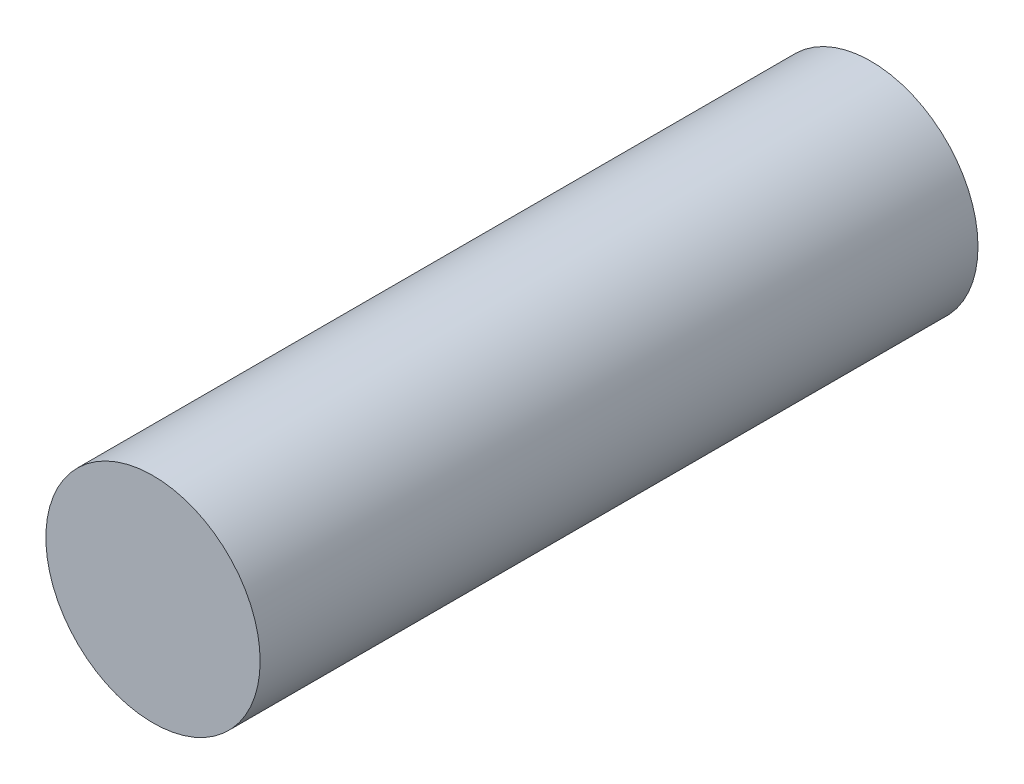
ISO-10303-21;
HEADER;
FILE_DESCRIPTION(('STEP AP214'),'2;1');
FILE_NAME('part.step','',(''),(''),'','','');
FILE_SCHEMA(('AUTOMOTIVE_DESIGN { 1 0 10303 214 1 1 1 1 }'));
ENDSEC;
DATA;
#1=APPLICATION_CONTEXT('core data for automotive mechanical design processes');
#2=APPLICATION_PROTOCOL_DEFINITION('international standard','automotive_design',2000,#1);
#3=PRODUCT_CONTEXT('',#1,'mechanical');
#4=PRODUCT('Part','Part','',(#3));
#5=PRODUCT_RELATED_PRODUCT_CATEGORY('part','',(#4));
#6=PRODUCT_DEFINITION_FORMATION('','',#4);
#7=PRODUCT_DEFINITION_CONTEXT('part definition',#1,'design');
#8=PRODUCT_DEFINITION('design','',#6,#7);
#9=PRODUCT_DEFINITION_SHAPE('','',#8);
#10=(LENGTH_UNIT() NAMED_UNIT(*) SI_UNIT(.MILLI.,.METRE.));
#11=(NAMED_UNIT(*) PLANE_ANGLE_UNIT() SI_UNIT($,.RADIAN.));
#12=(NAMED_UNIT(*) SI_UNIT($,.STERADIAN.) SOLID_ANGLE_UNIT());
#13=UNCERTAINTY_MEASURE_WITH_UNIT(LENGTH_MEASURE(1.E-05),#10,'distance_accuracy_value','');
#14=(GEOMETRIC_REPRESENTATION_CONTEXT(3) GLOBAL_UNCERTAINTY_ASSIGNED_CONTEXT((#13)) GLOBAL_UNIT_ASSIGNED_CONTEXT((#10,
#11,#12)) REPRESENTATION_CONTEXT('',''));
#15=CARTESIAN_POINT('',(0.,0.,0.));
#16=DIRECTION('',(0.,0.,1.));
#17=DIRECTION('',(1.,0.,0.));
#18=AXIS2_PLACEMENT_3D('',#15,#16,#17);
#19=CARTESIAN_POINT('',(0.,0.,67.));
#20=DIRECTION('',(0.,0.,-1.));
#21=DIRECTION('',(-1.,0.,0.));
#22=AXIS2_PLACEMENT_3D('',#19,#20,#21);
#23=CYLINDRICAL_SURFACE('',#22,10.);
#24=CARTESIAN_POINT('',(0.,0.,67.));
#25=DIRECTION('',(0.,0.,1.));
#26=DIRECTION('',(1.,0.,0.));
#27=AXIS2_PLACEMENT_3D('',#24,#25,#26);
#28=CIRCLE('',#27,10.);
#29=CARTESIAN_POINT('',(10.,0.,67.));
#30=VERTEX_POINT('',#29);
#31=EDGE_CURVE('E10',#30,#30,#28,.T.);
#32=ORIENTED_EDGE('',*,*,#31,.F.);
#33=EDGE_LOOP('',(#32));
#34=FACE_BOUND('',#33,.T.);
#35=CARTESIAN_POINT('',(0.,0.,0.));
#36=DIRECTION('',(0.,0.,1.));
#37=DIRECTION('',(1.,0.,0.));
#38=AXIS2_PLACEMENT_3D('',#35,#36,#37);
#39=CIRCLE('',#38,10.);
#40=CARTESIAN_POINT('',(10.,0.,0.));
#41=VERTEX_POINT('',#40);
#42=EDGE_CURVE('E34',#41,#41,#39,.T.);
#43=ORIENTED_EDGE('',*,*,#42,.T.);
#44=EDGE_LOOP('',(#43));
#45=FACE_BOUND('',#44,.T.);
#46=ADVANCED_FACE('F31',(#34,#45),#23,.T.);
#47=CARTESIAN_POINT('',(0.,0.,67.));
#48=DIRECTION('',(0.,0.,1.));
#49=DIRECTION('',(1.,0.,0.));
#50=AXIS2_PLACEMENT_3D('',#47,#48,#49);
#51=PLANE('',#50);
#52=ORIENTED_EDGE('',*,*,#31,.T.);
#53=EDGE_LOOP('',(#52));
#54=FACE_BOUND('',#53,.T.);
#55=ADVANCED_FACE('F46',(#54),#51,.T.);
#56=CARTESIAN_POINT('',(0.,0.,0.));
#57=DIRECTION('',(0.,0.,1.));
#58=DIRECTION('',(1.,0.,0.));
#59=AXIS2_PLACEMENT_3D('',#56,#57,#58);
#60=PLANE('',#59);
#61=ORIENTED_EDGE('',*,*,#42,.F.);
#62=EDGE_LOOP('',(#61));
#63=FACE_BOUND('',#62,.T.);
#64=ADVANCED_FACE('F44',(#63),#60,.F.);
#65=CLOSED_SHELL('',(#46,#55,#64));
#66=MANIFOLD_SOLID_BREP('B2',#65);
#67=ADVANCED_BREP_SHAPE_REPRESENTATION('',(#18,#66),#14);
#68=SHAPE_DEFINITION_REPRESENTATION(#9,#67);
ENDSEC;
END-ISO-10303-21;
